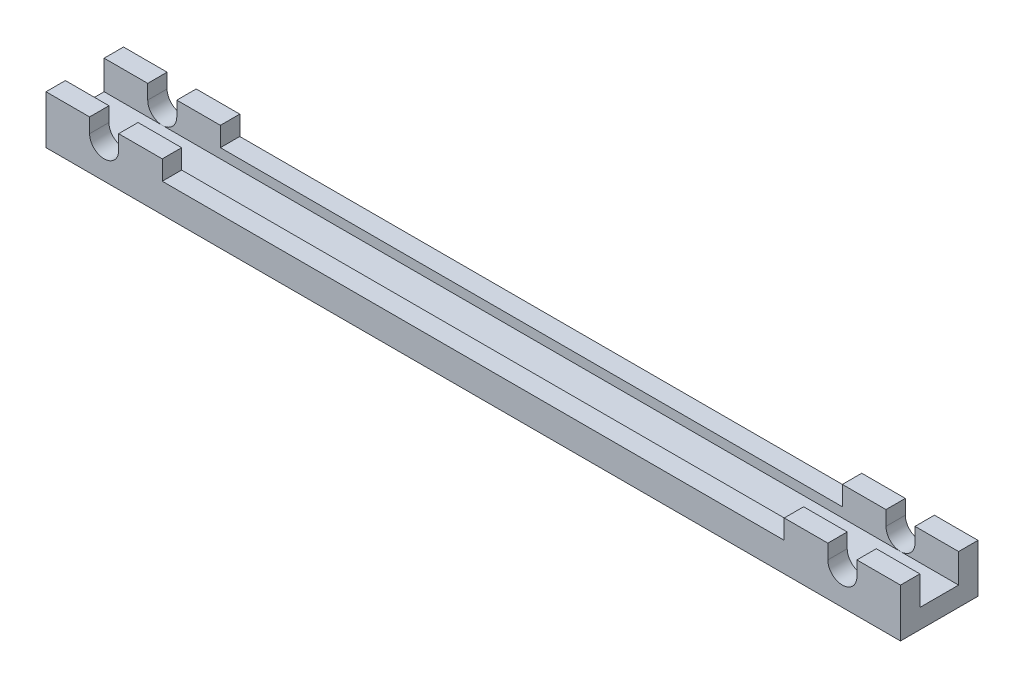
ISO-10303-21;
HEADER;
FILE_DESCRIPTION(('STEP AP214'),'2;1');
FILE_NAME('part.step','',(''),(''),'','','');
FILE_SCHEMA(('AUTOMOTIVE_DESIGN { 1 0 10303 214 1 1 1 1 }'));
ENDSEC;
DATA;
#1=APPLICATION_CONTEXT('core data for automotive mechanical design processes');
#2=APPLICATION_PROTOCOL_DEFINITION('international standard','automotive_design',2000,#1);
#3=PRODUCT_CONTEXT('',#1,'mechanical');
#4=PRODUCT('Part','Part','',(#3));
#5=PRODUCT_RELATED_PRODUCT_CATEGORY('part','',(#4));
#6=PRODUCT_DEFINITION_FORMATION('','',#4);
#7=PRODUCT_DEFINITION_CONTEXT('part definition',#1,'design');
#8=PRODUCT_DEFINITION('design','',#6,#7);
#9=PRODUCT_DEFINITION_SHAPE('','',#8);
#10=(LENGTH_UNIT() NAMED_UNIT(*) SI_UNIT(.MILLI.,.METRE.));
#11=(NAMED_UNIT(*) PLANE_ANGLE_UNIT() SI_UNIT($,.RADIAN.));
#12=(NAMED_UNIT(*) SI_UNIT($,.STERADIAN.) SOLID_ANGLE_UNIT());
#13=UNCERTAINTY_MEASURE_WITH_UNIT(LENGTH_MEASURE(1.E-05),#10,'distance_accuracy_value','');
#14=(GEOMETRIC_REPRESENTATION_CONTEXT(3) GLOBAL_UNCERTAINTY_ASSIGNED_CONTEXT((#13)) GLOBAL_UNIT_ASSIGNED_CONTEXT((#10,
#11,#12)) REPRESENTATION_CONTEXT('',''));
#15=CARTESIAN_POINT('',(0.,0.,0.));
#16=DIRECTION('',(0.,0.,1.));
#17=DIRECTION('',(1.,0.,0.));
#18=AXIS2_PLACEMENT_3D('',#15,#16,#17);
#19=CARTESIAN_POINT('',(0.,2.,3.99999999999999));
#20=DIRECTION('',(0.,0.,-1.));
#21=DIRECTION('',(-1.,0.,0.));
#22=AXIS2_PLACEMENT_3D('',#19,#20,#21);
#23=PLANE('',#22);
#24=DIRECTION('',(0.,1.,0.));
#25=VECTOR('',#24,1.);
#26=CARTESIAN_POINT('',(-39.6,5.,3.99999999999999));
#27=LINE('',#26,#25);
#28=CARTESIAN_POINT('',(-39.6,3.5,3.99999999999999));
#29=VERTEX_POINT('',#28);
#30=CARTESIAN_POINT('',(-39.6,5.,3.99999999999999));
#31=VERTEX_POINT('',#30);
#32=EDGE_CURVE('E291',#29,#31,#27,.T.);
#33=ORIENTED_EDGE('',*,*,#32,.T.);
#34=DIRECTION('',(-1.,0.,0.));
#35=VECTOR('',#34,1.);
#36=CARTESIAN_POINT('',(-44.1,5.,3.99999999999999));
#37=LINE('',#36,#35);
#38=CARTESIAN_POINT('',(-44.1,5.,3.99999999999999));
#39=VERTEX_POINT('',#38);
#40=EDGE_CURVE('E334',#31,#39,#37,.T.);
#41=ORIENTED_EDGE('',*,*,#40,.T.);
#42=DIRECTION('',(0.,-1.,0.));
#43=VECTOR('',#42,1.);
#44=CARTESIAN_POINT('',(-44.1,2.,3.99999999999999));
#45=LINE('',#44,#43);
#46=CARTESIAN_POINT('',(-44.1,0.,3.99999999999999));
#47=VERTEX_POINT('',#46);
#48=EDGE_CURVE('E377',#39,#47,#45,.T.);
#49=ORIENTED_EDGE('',*,*,#48,.T.);
#50=DIRECTION('',(1.,0.,0.));
#51=VECTOR('',#50,1.);
#52=CARTESIAN_POINT('',(0.,0.,3.99999999999999));
#53=LINE('',#52,#51);
#54=CARTESIAN_POINT('',(44.1,0.,3.99999999999999));
#55=VERTEX_POINT('',#54);
#56=EDGE_CURVE('E487',#47,#55,#53,.T.);
#57=ORIENTED_EDGE('',*,*,#56,.T.);
#58=DIRECTION('',(0.,-1.,0.));
#59=VECTOR('',#58,1.);
#60=CARTESIAN_POINT('',(44.1,2.,3.99999999999999));
#61=LINE('',#60,#59);
#62=CARTESIAN_POINT('',(44.1,5.,3.99999999999999));
#63=VERTEX_POINT('',#62);
#64=EDGE_CURVE('E499',#63,#55,#61,.T.);
#65=ORIENTED_EDGE('',*,*,#64,.F.);
#66=DIRECTION('',(1.,0.,0.));
#67=VECTOR('',#66,1.);
#68=CARTESIAN_POINT('',(44.1,5.,3.99999999999999));
#69=LINE('',#68,#67);
#70=CARTESIAN_POINT('',(39.6,5.,4.));
#71=VERTEX_POINT('',#70);
#72=EDGE_CURVE('E447',#71,#63,#69,.T.);
#73=ORIENTED_EDGE('',*,*,#72,.F.);
#74=DIRECTION('',(0.,1.,0.));
#75=VECTOR('',#74,1.);
#76=CARTESIAN_POINT('',(39.6,5.,3.99999999999999));
#77=LINE('',#76,#75);
#78=CARTESIAN_POINT('',(39.6,3.5,3.99999999999999));
#79=VERTEX_POINT('',#78);
#80=EDGE_CURVE('E406',#79,#71,#77,.T.);
#81=ORIENTED_EDGE('',*,*,#80,.F.);
#82=CARTESIAN_POINT('',(38.1,3.5,3.99999999999999));
#83=DIRECTION('',(0.,0.,1.));
#84=DIRECTION('',(1.,0.,0.));
#85=AXIS2_PLACEMENT_3D('',#82,#83,#84);
#86=CIRCLE('',#85,1.5);
#87=CARTESIAN_POINT('',(36.6,3.5,3.99999999999999));
#88=VERTEX_POINT('',#87);
#89=EDGE_CURVE('E392',#88,#79,#86,.T.);
#90=ORIENTED_EDGE('',*,*,#89,.F.);
#91=DIRECTION('',(0.,-1.,0.));
#92=VECTOR('',#91,1.);
#93=CARTESIAN_POINT('',(36.6,3.5,3.99999999999999));
#94=LINE('',#93,#92);
#95=CARTESIAN_POINT('',(36.6,5.,3.99999999999999));
#96=VERTEX_POINT('',#95);
#97=EDGE_CURVE('E397',#96,#88,#94,.T.);
#98=ORIENTED_EDGE('',*,*,#97,.F.);
#99=CARTESIAN_POINT('',(32.1,5.,4.));
#100=VERTEX_POINT('',#99);
#101=EDGE_CURVE('E448',#100,#96,#69,.T.);
#102=ORIENTED_EDGE('',*,*,#101,.F.);
#103=DIRECTION('',(0.,-1.,0.));
#104=VECTOR('',#103,1.);
#105=CARTESIAN_POINT('',(32.1,5.,4.));
#106=LINE('',#105,#104);
#107=CARTESIAN_POINT('',(32.1,3.,4.));
#108=VERTEX_POINT('',#107);
#109=EDGE_CURVE('E451',#100,#108,#106,.T.);
#110=ORIENTED_EDGE('',*,*,#109,.T.);
#111=DIRECTION('',(1.,0.,0.));
#112=VECTOR('',#111,1.);
#113=CARTESIAN_POINT('',(32.1,3.,4.));
#114=LINE('',#113,#112);
#115=CARTESIAN_POINT('',(-32.1,3.,4.));
#116=VERTEX_POINT('',#115);
#117=EDGE_CURVE('E390',#116,#108,#114,.T.);
#118=ORIENTED_EDGE('',*,*,#117,.F.);
#119=DIRECTION('',(0.,-1.,0.));
#120=VECTOR('',#119,1.);
#121=CARTESIAN_POINT('',(-32.1,5.,4.));
#122=LINE('',#121,#120);
#123=CARTESIAN_POINT('',(-32.1,5.,4.));
#124=VERTEX_POINT('',#123);
#125=EDGE_CURVE('E354',#124,#116,#122,.T.);
#126=ORIENTED_EDGE('',*,*,#125,.F.);
#127=CARTESIAN_POINT('',(-36.6,5.,4.));
#128=VERTEX_POINT('',#127);
#129=EDGE_CURVE('E336',#124,#128,#37,.T.);
#130=ORIENTED_EDGE('',*,*,#129,.T.);
#131=DIRECTION('',(0.,-1.,0.));
#132=VECTOR('',#131,1.);
#133=CARTESIAN_POINT('',(-36.6,3.5,3.99999999999999));
#134=LINE('',#133,#132);
#135=CARTESIAN_POINT('',(-36.6,3.5,3.99999999999999));
#136=VERTEX_POINT('',#135);
#137=EDGE_CURVE('E298',#128,#136,#134,.T.);
#138=ORIENTED_EDGE('',*,*,#137,.T.);
#139=CARTESIAN_POINT('',(-38.1,3.5,3.99999999999999));
#140=DIRECTION('',(0.,0.,-1.));
#141=DIRECTION('',(-1.,0.,0.));
#142=AXIS2_PLACEMENT_3D('',#139,#140,#141);
#143=CIRCLE('',#142,1.5);
#144=EDGE_CURVE('E285',#136,#29,#143,.T.);
#145=ORIENTED_EDGE('',*,*,#144,.T.);
#146=EDGE_LOOP('',(#33,#41,#49,#57,#65,#73,#81,#90,#98,#102,#110,#118,#126,#130,#138,#145));
#147=FACE_BOUND('',#146,.T.);
#148=ADVANCED_FACE('F37',(#147),#23,.F.);
#149=CARTESIAN_POINT('',(0.,2.,-3.99999999999999));
#150=DIRECTION('',(0.,0.,1.));
#151=DIRECTION('',(1.,0.,0.));
#152=AXIS2_PLACEMENT_3D('',#149,#150,#151);
#153=PLANE('',#152);
#154=DIRECTION('',(0.,-1.,0.));
#155=VECTOR('',#154,1.);
#156=CARTESIAN_POINT('',(-32.1,5.,-4.));
#157=LINE('',#156,#155);
#158=CARTESIAN_POINT('',(-32.1,5.,-4.));
#159=VERTEX_POINT('',#158);
#160=CARTESIAN_POINT('',(-32.1,3.,-4.));
#161=VERTEX_POINT('',#160);
#162=EDGE_CURVE('E280',#159,#161,#157,.T.);
#163=ORIENTED_EDGE('',*,*,#162,.T.);
#164=DIRECTION('',(-1.,0.,0.));
#165=VECTOR('',#164,1.);
#166=CARTESIAN_POINT('',(32.1,3.,-3.99999999999999));
#167=LINE('',#166,#165);
#168=CARTESIAN_POINT('',(32.1,3.,-3.99999999999999));
#169=VERTEX_POINT('',#168);
#170=EDGE_CURVE('E51',#169,#161,#167,.T.);
#171=ORIENTED_EDGE('',*,*,#170,.F.);
#172=DIRECTION('',(0.,-1.,0.));
#173=VECTOR('',#172,1.);
#174=CARTESIAN_POINT('',(32.1,5.,-4.));
#175=LINE('',#174,#173);
#176=CARTESIAN_POINT('',(32.1,5.,-4.));
#177=VERTEX_POINT('',#176);
#178=EDGE_CURVE('E484',#177,#169,#175,.T.);
#179=ORIENTED_EDGE('',*,*,#178,.F.);
#180=DIRECTION('',(-1.,0.,0.));
#181=VECTOR('',#180,1.);
#182=CARTESIAN_POINT('',(44.1,5.,-4.00000000000001));
#183=LINE('',#182,#181);
#184=CARTESIAN_POINT('',(36.6,5.,-4.00000000000001));
#185=VERTEX_POINT('',#184);
#186=EDGE_CURVE('E467',#185,#177,#183,.T.);
#187=ORIENTED_EDGE('',*,*,#186,.F.);
#188=DIRECTION('',(0.,-1.,0.));
#189=VECTOR('',#188,1.);
#190=CARTESIAN_POINT('',(36.6,3.5,-4.00000000000001));
#191=LINE('',#190,#189);
#192=CARTESIAN_POINT('',(36.6,3.5,-4.00000000000001));
#193=VERTEX_POINT('',#192);
#194=EDGE_CURVE('E400',#185,#193,#191,.T.);
#195=ORIENTED_EDGE('',*,*,#194,.T.);
#196=CARTESIAN_POINT('',(38.1,3.5,-4.00000000000001));
#197=DIRECTION('',(0.,0.,1.));
#198=DIRECTION('',(1.,0.,0.));
#199=AXIS2_PLACEMENT_3D('',#196,#197,#198);
#200=CIRCLE('',#199,1.5);
#201=CARTESIAN_POINT('',(39.6,3.5,-4.00000000000001));
#202=VERTEX_POINT('',#201);
#203=EDGE_CURVE('E393',#193,#202,#200,.T.);
#204=ORIENTED_EDGE('',*,*,#203,.T.);
#205=DIRECTION('',(0.,1.,0.));
#206=VECTOR('',#205,1.);
#207=CARTESIAN_POINT('',(39.6,5.,-4.00000000000001));
#208=LINE('',#207,#206);
#209=CARTESIAN_POINT('',(39.6,5.,-4.00000000000001));
#210=VERTEX_POINT('',#209);
#211=EDGE_CURVE('E396',#202,#210,#208,.T.);
#212=ORIENTED_EDGE('',*,*,#211,.T.);
#213=CARTESIAN_POINT('',(44.1,5.,-4.00000000000001));
#214=VERTEX_POINT('',#213);
#215=EDGE_CURVE('E469',#214,#210,#183,.T.);
#216=ORIENTED_EDGE('',*,*,#215,.F.);
#217=DIRECTION('',(0.,-1.,0.));
#218=VECTOR('',#217,1.);
#219=CARTESIAN_POINT('',(44.1,2.,-4.00000000000001));
#220=LINE('',#219,#218);
#221=CARTESIAN_POINT('',(44.1,0.,-4.00000000000001));
#222=VERTEX_POINT('',#221);
#223=EDGE_CURVE('E491',#214,#222,#220,.T.);
#224=ORIENTED_EDGE('',*,*,#223,.T.);
#225=DIRECTION('',(-1.,0.,0.));
#226=VECTOR('',#225,1.);
#227=CARTESIAN_POINT('',(0.,0.,-3.99999999999999));
#228=LINE('',#227,#226);
#229=CARTESIAN_POINT('',(-44.1,0.,-4.00000000000001));
#230=VERTEX_POINT('',#229);
#231=EDGE_CURVE('E492',#222,#230,#228,.T.);
#232=ORIENTED_EDGE('',*,*,#231,.T.);
#233=DIRECTION('',(0.,-1.,0.));
#234=VECTOR('',#233,1.);
#235=CARTESIAN_POINT('',(-44.1,2.,-4.00000000000001));
#236=LINE('',#235,#234);
#237=CARTESIAN_POINT('',(-44.1,5.,-4.00000000000001));
#238=VERTEX_POINT('',#237);
#239=EDGE_CURVE('E382',#238,#230,#236,.T.);
#240=ORIENTED_EDGE('',*,*,#239,.F.);
#241=DIRECTION('',(1.,0.,0.));
#242=VECTOR('',#241,1.);
#243=CARTESIAN_POINT('',(-44.1,5.,-4.00000000000001));
#244=LINE('',#243,#242);
#245=CARTESIAN_POINT('',(-39.6,5.,-4.00000000000001));
#246=VERTEX_POINT('',#245);
#247=EDGE_CURVE('E366',#238,#246,#244,.T.);
#248=ORIENTED_EDGE('',*,*,#247,.T.);
#249=DIRECTION('',(0.,1.,0.));
#250=VECTOR('',#249,1.);
#251=CARTESIAN_POINT('',(-39.6,5.,-4.00000000000001));
#252=LINE('',#251,#250);
#253=CARTESIAN_POINT('',(-39.6,3.5,-4.00000000000001));
#254=VERTEX_POINT('',#253);
#255=EDGE_CURVE('E293',#254,#246,#252,.T.);
#256=ORIENTED_EDGE('',*,*,#255,.F.);
#257=CARTESIAN_POINT('',(-38.1,3.5,-4.00000000000001));
#258=DIRECTION('',(0.,0.,-1.));
#259=DIRECTION('',(-1.,0.,0.));
#260=AXIS2_PLACEMENT_3D('',#257,#258,#259);
#261=CIRCLE('',#260,1.5);
#262=CARTESIAN_POINT('',(-36.6,3.5,-4.00000000000001));
#263=VERTEX_POINT('',#262);
#264=EDGE_CURVE('E288',#263,#254,#261,.T.);
#265=ORIENTED_EDGE('',*,*,#264,.F.);
#266=DIRECTION('',(0.,-1.,0.));
#267=VECTOR('',#266,1.);
#268=CARTESIAN_POINT('',(-36.6,3.5,-4.00000000000001));
#269=LINE('',#268,#267);
#270=CARTESIAN_POINT('',(-36.6,5.,-4.00000000000001));
#271=VERTEX_POINT('',#270);
#272=EDGE_CURVE('E290',#271,#263,#269,.T.);
#273=ORIENTED_EDGE('',*,*,#272,.F.);
#274=EDGE_CURVE('E365',#271,#159,#244,.T.);
#275=ORIENTED_EDGE('',*,*,#274,.T.);
#276=EDGE_LOOP('',(#163,#171,#179,#187,#195,#204,#212,#216,#224,#232,#240,#248,#256,#265,#273,#275));
#277=FACE_BOUND('',#276,.T.);
#278=ADVANCED_FACE('F572',(#277),#153,.F.);
#279=CARTESIAN_POINT('',(-44.1,5.,-2.00000000000001));
#280=DIRECTION('',(0.,0.,1.));
#281=DIRECTION('',(1.,0.,0.));
#282=AXIS2_PLACEMENT_3D('',#279,#280,#281);
#283=PLANE('',#282);
#284=CARTESIAN_POINT('',(-38.1,3.5,-2.));
#285=DIRECTION('',(0.,0.,1.));
#286=DIRECTION('',(1.,0.,0.));
#287=AXIS2_PLACEMENT_3D('',#284,#285,#286);
#288=CIRCLE('',#287,1.5);
#289=CARTESIAN_POINT('',(-38.1,2.,-2.));
#290=VERTEX_POINT('',#289);
#291=CARTESIAN_POINT('',(-39.6,3.5,-2.));
#292=VERTEX_POINT('',#291);
#293=EDGE_CURVE('E330',#290,#292,#288,.F.);
#294=ORIENTED_EDGE('',*,*,#293,.T.);
#295=DIRECTION('',(0.,1.,0.));
#296=VECTOR('',#295,1.);
#297=CARTESIAN_POINT('',(-39.6,5.,-2.));
#298=LINE('',#297,#296);
#299=CARTESIAN_POINT('',(-39.6,5.,-2.));
#300=VERTEX_POINT('',#299);
#301=EDGE_CURVE('E324',#292,#300,#298,.T.);
#302=ORIENTED_EDGE('',*,*,#301,.T.);
#303=DIRECTION('',(-1.,0.,0.));
#304=VECTOR('',#303,1.);
#305=CARTESIAN_POINT('',(-44.1,5.,-2.00000000000001));
#306=LINE('',#305,#304);
#307=CARTESIAN_POINT('',(-44.1,5.,-2.00000000000001));
#308=VERTEX_POINT('',#307);
#309=EDGE_CURVE('E361',#300,#308,#306,.T.);
#310=ORIENTED_EDGE('',*,*,#309,.T.);
#311=DIRECTION('',(0.,-1.,0.));
#312=VECTOR('',#311,1.);
#313=CARTESIAN_POINT('',(-44.1,5.,-2.00000000000001));
#314=LINE('',#313,#312);
#315=CARTESIAN_POINT('',(-44.1,2.,-2.00000000000001));
#316=VERTEX_POINT('',#315);
#317=EDGE_CURVE('E279',#308,#316,#314,.T.);
#318=ORIENTED_EDGE('',*,*,#317,.T.);
#319=DIRECTION('',(-1.,0.,0.));
#320=VECTOR('',#319,1.);
#321=CARTESIAN_POINT('',(-44.1,2.,-2.00000000000001));
#322=LINE('',#321,#320);
#323=EDGE_CURVE('E357',#290,#316,#322,.T.);
#324=ORIENTED_EDGE('',*,*,#323,.F.);
#325=EDGE_LOOP('',(#294,#302,#310,#318,#324));
#326=FACE_BOUND('',#325,.T.);
#327=ADVANCED_FACE('F544',(#326),#283,.T.);
#328=CARTESIAN_POINT('',(0.,5.,0.));
#329=DIRECTION('',(0.,-1.,0.));
#330=DIRECTION('',(0.,0.,-1.));
#331=AXIS2_PLACEMENT_3D('',#328,#329,#330);
#332=PLANE('',#331);
#333=DIRECTION('',(0.,0.,1.));
#334=VECTOR('',#333,1.);
#335=CARTESIAN_POINT('',(-39.6,5.,-4.00000000000001));
#336=LINE('',#335,#334);
#337=EDGE_CURVE('E308',#246,#300,#336,.T.);
#338=ORIENTED_EDGE('',*,*,#337,.F.);
#339=ORIENTED_EDGE('',*,*,#247,.F.);
#340=DIRECTION('',(0.,0.,-1.));
#341=VECTOR('',#340,1.);
#342=CARTESIAN_POINT('',(-44.1,5.,-4.00000000000001));
#343=LINE('',#342,#341);
#344=EDGE_CURVE('E358',#308,#238,#343,.T.);
#345=ORIENTED_EDGE('',*,*,#344,.F.);
#346=ORIENTED_EDGE('',*,*,#309,.F.);
#347=EDGE_LOOP('',(#338,#339,#345,#346));
#348=FACE_BOUND('',#347,.T.);
#349=ADVANCED_FACE('F548',(#348),#332,.F.);
#350=DIRECTION('',(0.,0.,1.));
#351=VECTOR('',#350,1.);
#352=CARTESIAN_POINT('',(-36.6,5.,-4.00000000000001));
#353=LINE('',#352,#351);
#354=CARTESIAN_POINT('',(-36.6,5.,-2.));
#355=VERTEX_POINT('',#354);
#356=EDGE_CURVE('E310',#271,#355,#353,.T.);
#357=ORIENTED_EDGE('',*,*,#356,.T.);
#358=CARTESIAN_POINT('',(-32.1,5.,-2.));
#359=VERTEX_POINT('',#358);
#360=EDGE_CURVE('E362',#359,#355,#306,.T.);
#361=ORIENTED_EDGE('',*,*,#360,.F.);
#362=DIRECTION('',(0.,0.,1.));
#363=VECTOR('',#362,1.);
#364=CARTESIAN_POINT('',(-32.1,5.,-4.));
#365=LINE('',#364,#363);
#366=EDGE_CURVE('E278',#159,#359,#365,.T.);
#367=ORIENTED_EDGE('',*,*,#366,.F.);
#368=ORIENTED_EDGE('',*,*,#274,.F.);
#369=EDGE_LOOP('',(#357,#361,#367,#368));
#370=FACE_BOUND('',#369,.T.);
#371=ADVANCED_FACE('F568',(#370),#332,.F.);
#372=CARTESIAN_POINT('',(-44.1,5.,1.99999999999999));
#373=DIRECTION('',(0.,0.,-1.));
#374=DIRECTION('',(-1.,0.,0.));
#375=AXIS2_PLACEMENT_3D('',#372,#373,#374);
#376=PLANE('',#375);
#377=DIRECTION('',(1.,0.,0.));
#378=VECTOR('',#377,1.);
#379=CARTESIAN_POINT('',(-44.1,5.,1.99999999999999));
#380=LINE('',#379,#378);
#381=CARTESIAN_POINT('',(-44.1,5.,1.99999999999999));
#382=VERTEX_POINT('',#381);
#383=CARTESIAN_POINT('',(-39.6,5.,1.99999999999999));
#384=VERTEX_POINT('',#383);
#385=EDGE_CURVE('E343',#382,#384,#380,.T.);
#386=ORIENTED_EDGE('',*,*,#385,.T.);
#387=DIRECTION('',(0.,-1.,0.));
#388=VECTOR('',#387,1.);
#389=CARTESIAN_POINT('',(-39.6,5.,2.));
#390=LINE('',#389,#388);
#391=CARTESIAN_POINT('',(-39.6,3.5,1.99999999999999));
#392=VERTEX_POINT('',#391);
#393=EDGE_CURVE('E321',#384,#392,#390,.T.);
#394=ORIENTED_EDGE('',*,*,#393,.T.);
#395=CARTESIAN_POINT('',(-38.1,3.5,2.));
#396=DIRECTION('',(0.,0.,-1.));
#397=DIRECTION('',(-1.,0.,0.));
#398=AXIS2_PLACEMENT_3D('',#395,#396,#397);
#399=CIRCLE('',#398,1.5);
#400=CARTESIAN_POINT('',(-38.1,2.,2.));
#401=VERTEX_POINT('',#400);
#402=EDGE_CURVE('E11',#392,#401,#399,.F.);
#403=ORIENTED_EDGE('',*,*,#402,.T.);
#404=DIRECTION('',(1.,0.,0.));
#405=VECTOR('',#404,1.);
#406=CARTESIAN_POINT('',(-44.1,2.,1.99999999999999));
#407=LINE('',#406,#405);
#408=CARTESIAN_POINT('',(-44.1,2.,1.99999999999999));
#409=VERTEX_POINT('',#408);
#410=EDGE_CURVE('E335',#409,#401,#407,.T.);
#411=ORIENTED_EDGE('',*,*,#410,.F.);
#412=DIRECTION('',(0.,-1.,0.));
#413=VECTOR('',#412,1.);
#414=CARTESIAN_POINT('',(-44.1,5.,1.99999999999999));
#415=LINE('',#414,#413);
#416=EDGE_CURVE('E346',#382,#409,#415,.T.);
#417=ORIENTED_EDGE('',*,*,#416,.F.);
#418=EDGE_LOOP('',(#386,#394,#403,#411,#417));
#419=FACE_BOUND('',#418,.T.);
#420=ADVANCED_FACE('F531',(#419),#376,.T.);
#421=CARTESIAN_POINT('',(0.,5.,0.));
#422=DIRECTION('',(0.,1.,0.));
#423=DIRECTION('',(0.,0.,1.));
#424=AXIS2_PLACEMENT_3D('',#421,#422,#423);
#425=PLANE('',#424);
#426=ORIENTED_EDGE('',*,*,#40,.F.);
#427=DIRECTION('',(0.,0.,-1.));
#428=VECTOR('',#427,1.);
#429=CARTESIAN_POINT('',(-39.6,5.,0.));
#430=LINE('',#429,#428);
#431=EDGE_CURVE('E512',#31,#384,#430,.T.);
#432=ORIENTED_EDGE('',*,*,#431,.T.);
#433=ORIENTED_EDGE('',*,*,#385,.F.);
#434=DIRECTION('',(0.,0.,-1.));
#435=VECTOR('',#434,1.);
#436=CARTESIAN_POINT('',(-44.1,5.,3.99999999999999));
#437=LINE('',#436,#435);
#438=EDGE_CURVE('E331',#39,#382,#437,.T.);
#439=ORIENTED_EDGE('',*,*,#438,.F.);
#440=EDGE_LOOP('',(#426,#432,#433,#439));
#441=FACE_BOUND('',#440,.T.);
#442=ADVANCED_FACE('F559',(#441),#425,.T.);
#443=CARTESIAN_POINT('',(-36.6,5.,1.99999999999999));
#444=VERTEX_POINT('',#443);
#445=CARTESIAN_POINT('',(-32.1,5.,2.));
#446=VERTEX_POINT('',#445);
#447=EDGE_CURVE('E342',#444,#446,#380,.T.);
#448=ORIENTED_EDGE('',*,*,#447,.F.);
#449=DIRECTION('',(0.,0.,1.));
#450=VECTOR('',#449,1.);
#451=CARTESIAN_POINT('',(-36.6,5.,0.));
#452=LINE('',#451,#450);
#453=EDGE_CURVE('E510',#444,#128,#452,.T.);
#454=ORIENTED_EDGE('',*,*,#453,.T.);
#455=ORIENTED_EDGE('',*,*,#129,.F.);
#456=DIRECTION('',(0.,0.,1.));
#457=VECTOR('',#456,1.);
#458=CARTESIAN_POINT('',(-32.1,5.,4.));
#459=LINE('',#458,#457);
#460=EDGE_CURVE('E339',#446,#124,#459,.T.);
#461=ORIENTED_EDGE('',*,*,#460,.F.);
#462=EDGE_LOOP('',(#448,#454,#455,#461));
#463=FACE_BOUND('',#462,.T.);
#464=ADVANCED_FACE('F561',(#463),#425,.T.);
#465=CARTESIAN_POINT('',(0.,2.,0.));
#466=DIRECTION('',(0.,-1.,0.));
#467=DIRECTION('',(0.,0.,-1.));
#468=AXIS2_PLACEMENT_3D('',#465,#466,#467);
#469=PLANE('',#468);
#470=DIRECTION('',(1.,0.,0.));
#471=VECTOR('',#470,1.);
#472=CARTESIAN_POINT('',(44.1,2.,-2.00000000000001));
#473=LINE('',#472,#471);
#474=CARTESIAN_POINT('',(38.1,2.,-2.));
#475=VERTEX_POINT('',#474);
#476=EDGE_CURVE('E468',#290,#475,#473,.T.);
#477=ORIENTED_EDGE('',*,*,#476,.F.);
#478=ORIENTED_EDGE('',*,*,#323,.T.);
#479=DIRECTION('',(0.,0.,-1.));
#480=VECTOR('',#479,1.);
#481=CARTESIAN_POINT('',(-44.1,2.,3.99999999999999));
#482=LINE('',#481,#480);
#483=EDGE_CURVE('E374',#409,#316,#482,.T.);
#484=ORIENTED_EDGE('',*,*,#483,.F.);
#485=ORIENTED_EDGE('',*,*,#410,.T.);
#486=DIRECTION('',(-1.,0.,0.));
#487=VECTOR('',#486,1.);
#488=CARTESIAN_POINT('',(44.1,2.,1.99999999999999));
#489=LINE('',#488,#487);
#490=CARTESIAN_POINT('',(38.1,2.,2.));
#491=VERTEX_POINT('',#490);
#492=EDGE_CURVE('E454',#491,#401,#489,.T.);
#493=ORIENTED_EDGE('',*,*,#492,.F.);
#494=CARTESIAN_POINT('',(44.1,2.,1.99999999999999));
#495=VERTEX_POINT('',#494);
#496=EDGE_CURVE('E441',#495,#491,#489,.T.);
#497=ORIENTED_EDGE('',*,*,#496,.F.);
#498=DIRECTION('',(0.,0.,-1.));
#499=VECTOR('',#498,1.);
#500=CARTESIAN_POINT('',(44.1,2.,3.99999999999999));
#501=LINE('',#500,#499);
#502=CARTESIAN_POINT('',(44.1,2.,-2.));
#503=VERTEX_POINT('',#502);
#504=EDGE_CURVE('E488',#495,#503,#501,.T.);
#505=ORIENTED_EDGE('',*,*,#504,.T.);
#506=EDGE_CURVE('E463',#475,#503,#473,.T.);
#507=ORIENTED_EDGE('',*,*,#506,.F.);
#508=EDGE_LOOP('',(#477,#478,#484,#485,#493,#497,#505,#507));
#509=FACE_BOUND('',#508,.T.);
#510=ADVANCED_FACE('F534',(#509),#469,.F.);
#511=CARTESIAN_POINT('',(44.1,5.,-2.00000000000001));
#512=DIRECTION('',(0.,0.,-1.));
#513=DIRECTION('',(-1.,0.,0.));
#514=AXIS2_PLACEMENT_3D('',#511,#512,#513);
#515=PLANE('',#514);
#516=CARTESIAN_POINT('',(38.1,3.5,-2.));
#517=DIRECTION('',(0.,0.,-1.));
#518=DIRECTION('',(-1.,0.,0.));
#519=AXIS2_PLACEMENT_3D('',#516,#517,#518);
#520=CIRCLE('',#519,1.5);
#521=CARTESIAN_POINT('',(36.6,3.5,-2.));
#522=VERTEX_POINT('',#521);
#523=EDGE_CURVE('E434',#475,#522,#520,.T.);
#524=ORIENTED_EDGE('',*,*,#523,.T.);
#525=DIRECTION('',(0.,1.,0.));
#526=VECTOR('',#525,1.);
#527=CARTESIAN_POINT('',(36.6,5.,-2.));
#528=LINE('',#527,#526);
#529=CARTESIAN_POINT('',(36.6,5.,-2.));
#530=VERTEX_POINT('',#529);
#531=EDGE_CURVE('E431',#522,#530,#528,.T.);
#532=ORIENTED_EDGE('',*,*,#531,.T.);
#533=DIRECTION('',(1.,0.,0.));
#534=VECTOR('',#533,1.);
#535=CARTESIAN_POINT('',(44.1,5.,-2.00000000000001));
#536=LINE('',#535,#534);
#537=CARTESIAN_POINT('',(32.1,5.,-2.));
#538=VERTEX_POINT('',#537);
#539=EDGE_CURVE('E475',#538,#530,#536,.T.);
#540=ORIENTED_EDGE('',*,*,#539,.F.);
#541=DIRECTION('',(0.,-1.,0.));
#542=VECTOR('',#541,1.);
#543=CARTESIAN_POINT('',(32.1,5.,-2.));
#544=LINE('',#543,#542);
#545=CARTESIAN_POINT('',(32.1,3.,-2.));
#546=VERTEX_POINT('',#545);
#547=EDGE_CURVE('E267',#538,#546,#544,.T.);
#548=ORIENTED_EDGE('',*,*,#547,.T.);
#549=DIRECTION('',(1.,0.,0.));
#550=VECTOR('',#549,1.);
#551=CARTESIAN_POINT('',(32.1,3.,-2.));
#552=LINE('',#551,#550);
#553=CARTESIAN_POINT('',(-32.1,3.,-2.));
#554=VERTEX_POINT('',#553);
#555=EDGE_CURVE('E258',#554,#546,#552,.T.);
#556=ORIENTED_EDGE('',*,*,#555,.F.);
#557=DIRECTION('',(0.,-1.,0.));
#558=VECTOR('',#557,1.);
#559=CARTESIAN_POINT('',(-32.1,5.,-2.));
#560=LINE('',#559,#558);
#561=EDGE_CURVE('E263',#359,#554,#560,.T.);
#562=ORIENTED_EDGE('',*,*,#561,.F.);
#563=ORIENTED_EDGE('',*,*,#360,.T.);
#564=DIRECTION('',(0.,-1.,0.));
#565=VECTOR('',#564,1.);
#566=CARTESIAN_POINT('',(-36.6,5.,-2.));
#567=LINE('',#566,#565);
#568=CARTESIAN_POINT('',(-36.6,3.5,-2.));
#569=VERTEX_POINT('',#568);
#570=EDGE_CURVE('E318',#355,#569,#567,.T.);
#571=ORIENTED_EDGE('',*,*,#570,.T.);
#572=EDGE_CURVE('E327',#569,#290,#288,.F.);
#573=ORIENTED_EDGE('',*,*,#572,.T.);
#574=ORIENTED_EDGE('',*,*,#476,.T.);
#575=EDGE_LOOP('',(#524,#532,#540,#548,#556,#562,#563,#571,#573,#574));
#576=FACE_BOUND('',#575,.T.);
#577=ADVANCED_FACE('F261',(#576),#515,.F.);
#578=CARTESIAN_POINT('',(0.,5.,0.));
#579=DIRECTION('',(0.,-1.,0.));
#580=DIRECTION('',(0.,0.,-1.));
#581=AXIS2_PLACEMENT_3D('',#578,#579,#580);
#582=PLANE('',#581);
#583=ORIENTED_EDGE('',*,*,#539,.T.);
#584=DIRECTION('',(0.,0.,1.));
#585=VECTOR('',#584,1.);
#586=CARTESIAN_POINT('',(36.6,5.,-4.00000000000001));
#587=LINE('',#586,#585);
#588=EDGE_CURVE('E415',#185,#530,#587,.T.);
#589=ORIENTED_EDGE('',*,*,#588,.F.);
#590=ORIENTED_EDGE('',*,*,#186,.T.);
#591=DIRECTION('',(0.,0.,1.));
#592=VECTOR('',#591,1.);
#593=CARTESIAN_POINT('',(32.1,5.,-4.));
#594=LINE('',#593,#592);
#595=EDGE_CURVE('E472',#177,#538,#594,.T.);
#596=ORIENTED_EDGE('',*,*,#595,.T.);
#597=EDGE_LOOP('',(#583,#589,#590,#596));
#598=FACE_BOUND('',#597,.T.);
#599=ADVANCED_FACE('F665',(#598),#582,.F.);
#600=CARTESIAN_POINT('',(44.1,5.,1.99999999999999));
#601=DIRECTION('',(0.,0.,1.));
#602=DIRECTION('',(1.,0.,0.));
#603=AXIS2_PLACEMENT_3D('',#600,#601,#602);
#604=PLANE('',#603);
#605=DIRECTION('',(-1.,0.,0.));
#606=VECTOR('',#605,1.);
#607=CARTESIAN_POINT('',(44.1,5.,1.99999999999999));
#608=LINE('',#607,#606);
#609=CARTESIAN_POINT('',(36.6,5.,1.99999999999999));
#610=VERTEX_POINT('',#609);
#611=CARTESIAN_POINT('',(32.1,5.,2.));
#612=VERTEX_POINT('',#611);
#613=EDGE_CURVE('E440',#610,#612,#608,.T.);
#614=ORIENTED_EDGE('',*,*,#613,.F.);
#615=DIRECTION('',(0.,-1.,0.));
#616=VECTOR('',#615,1.);
#617=CARTESIAN_POINT('',(36.6,5.,2.));
#618=LINE('',#617,#616);
#619=CARTESIAN_POINT('',(36.6,3.5,2.));
#620=VERTEX_POINT('',#619);
#621=EDGE_CURVE('E428',#610,#620,#618,.T.);
#622=ORIENTED_EDGE('',*,*,#621,.T.);
#623=CARTESIAN_POINT('',(38.1,3.5,2.));
#624=DIRECTION('',(0.,0.,1.));
#625=DIRECTION('',(1.,0.,0.));
#626=AXIS2_PLACEMENT_3D('',#623,#624,#625);
#627=CIRCLE('',#626,1.5);
#628=EDGE_CURVE('E509',#620,#491,#627,.T.);
#629=ORIENTED_EDGE('',*,*,#628,.T.);
#630=ORIENTED_EDGE('',*,*,#492,.T.);
#631=CARTESIAN_POINT('',(-36.6,3.5,2.));
#632=VERTEX_POINT('',#631);
#633=EDGE_CURVE('E40',#401,#632,#399,.F.);
#634=ORIENTED_EDGE('',*,*,#633,.T.);
#635=DIRECTION('',(0.,1.,0.));
#636=VECTOR('',#635,1.);
#637=CARTESIAN_POINT('',(-36.6,5.,2.));
#638=LINE('',#637,#636);
#639=EDGE_CURVE('E306',#632,#444,#638,.T.);
#640=ORIENTED_EDGE('',*,*,#639,.T.);
#641=ORIENTED_EDGE('',*,*,#447,.T.);
#642=DIRECTION('',(0.,-1.,0.));
#643=VECTOR('',#642,1.);
#644=CARTESIAN_POINT('',(-32.1,5.,2.));
#645=LINE('',#644,#643);
#646=CARTESIAN_POINT('',(-32.1,3.,2.));
#647=VERTEX_POINT('',#646);
#648=EDGE_CURVE('E351',#446,#647,#645,.T.);
#649=ORIENTED_EDGE('',*,*,#648,.T.);
#650=DIRECTION('',(-1.,0.,0.));
#651=VECTOR('',#650,1.);
#652=CARTESIAN_POINT('',(32.1,3.,2.));
#653=LINE('',#652,#651);
#654=CARTESIAN_POINT('',(32.1,3.,2.));
#655=VERTEX_POINT('',#654);
#656=EDGE_CURVE('E59',#655,#647,#653,.T.);
#657=ORIENTED_EDGE('',*,*,#656,.F.);
#658=DIRECTION('',(0.,-1.,0.));
#659=VECTOR('',#658,1.);
#660=CARTESIAN_POINT('',(32.1,5.,2.));
#661=LINE('',#660,#659);
#662=EDGE_CURVE('E457',#612,#655,#661,.T.);
#663=ORIENTED_EDGE('',*,*,#662,.F.);
#664=EDGE_LOOP('',(#614,#622,#629,#630,#634,#640,#641,#649,#657,#663));
#665=FACE_BOUND('',#664,.T.);
#666=ADVANCED_FACE('F521',(#665),#604,.F.);
#667=CARTESIAN_POINT('',(0.,5.,0.));
#668=DIRECTION('',(0.,1.,0.));
#669=DIRECTION('',(0.,0.,1.));
#670=AXIS2_PLACEMENT_3D('',#667,#668,#669);
#671=PLANE('',#670);
#672=DIRECTION('',(0.,0.,1.));
#673=VECTOR('',#672,1.);
#674=CARTESIAN_POINT('',(36.6,5.,0.));
#675=LINE('',#674,#673);
#676=EDGE_CURVE('E504',#610,#96,#675,.T.);
#677=ORIENTED_EDGE('',*,*,#676,.F.);
#678=ORIENTED_EDGE('',*,*,#613,.T.);
#679=DIRECTION('',(0.,0.,1.));
#680=VECTOR('',#679,1.);
#681=CARTESIAN_POINT('',(32.1,5.,4.));
#682=LINE('',#681,#680);
#683=EDGE_CURVE('E445',#612,#100,#682,.T.);
#684=ORIENTED_EDGE('',*,*,#683,.T.);
#685=ORIENTED_EDGE('',*,*,#101,.T.);
#686=EDGE_LOOP('',(#677,#678,#684,#685));
#687=FACE_BOUND('',#686,.T.);
#688=ADVANCED_FACE('F585',(#687),#671,.T.);
#689=CARTESIAN_POINT('',(44.1,2.,3.99999999999999));
#690=DIRECTION('',(-1.,0.,0.));
#691=DIRECTION('',(0.,0.,1.));
#692=AXIS2_PLACEMENT_3D('',#689,#690,#691);
#693=PLANE('',#692);
#694=DIRECTION('',(0.,0.,-1.));
#695=VECTOR('',#694,1.);
#696=CARTESIAN_POINT('',(44.1,0.,3.99999999999999));
#697=LINE('',#696,#695);
#698=EDGE_CURVE('E494',#55,#222,#697,.T.);
#699=ORIENTED_EDGE('',*,*,#698,.T.);
#700=ORIENTED_EDGE('',*,*,#223,.F.);
#701=DIRECTION('',(0.,0.,-1.));
#702=VECTOR('',#701,1.);
#703=CARTESIAN_POINT('',(44.1,5.,-4.00000000000001));
#704=LINE('',#703,#702);
#705=CARTESIAN_POINT('',(44.1,5.,-2.00000000000001));
#706=VERTEX_POINT('',#705);
#707=EDGE_CURVE('E464',#706,#214,#704,.T.);
#708=ORIENTED_EDGE('',*,*,#707,.F.);
#709=DIRECTION('',(0.,-1.,0.));
#710=VECTOR('',#709,1.);
#711=CARTESIAN_POINT('',(44.1,5.,-2.00000000000001));
#712=LINE('',#711,#710);
#713=EDGE_CURVE('E478',#706,#503,#712,.T.);
#714=ORIENTED_EDGE('',*,*,#713,.T.);
#715=ORIENTED_EDGE('',*,*,#504,.F.);
#716=DIRECTION('',(0.,-1.,0.));
#717=VECTOR('',#716,1.);
#718=CARTESIAN_POINT('',(44.1,5.,1.99999999999999));
#719=LINE('',#718,#717);
#720=CARTESIAN_POINT('',(44.1,5.,1.99999999999999));
#721=VERTEX_POINT('',#720);
#722=EDGE_CURVE('E460',#721,#495,#719,.T.);
#723=ORIENTED_EDGE('',*,*,#722,.F.);
#724=DIRECTION('',(0.,0.,-1.));
#725=VECTOR('',#724,1.);
#726=CARTESIAN_POINT('',(44.1,5.,3.99999999999999));
#727=LINE('',#726,#725);
#728=EDGE_CURVE('E437',#63,#721,#727,.T.);
#729=ORIENTED_EDGE('',*,*,#728,.F.);
#730=ORIENTED_EDGE('',*,*,#64,.T.);
#731=EDGE_LOOP('',(#699,#700,#708,#714,#715,#723,#729,#730));
#732=FACE_BOUND('',#731,.T.);
#733=ADVANCED_FACE('F583',(#732),#693,.F.);
#734=CARTESIAN_POINT('',(0.,0.,0.));
#735=DIRECTION('',(0.,-1.,0.));
#736=DIRECTION('',(0.,0.,-1.));
#737=AXIS2_PLACEMENT_3D('',#734,#735,#736);
#738=PLANE('',#737);
#739=ORIENTED_EDGE('',*,*,#56,.F.);
#740=DIRECTION('',(0.,0.,-1.));
#741=VECTOR('',#740,1.);
#742=CARTESIAN_POINT('',(-44.1,0.,3.99999999999999));
#743=LINE('',#742,#741);
#744=EDGE_CURVE('E373',#47,#230,#743,.T.);
#745=ORIENTED_EDGE('',*,*,#744,.T.);
#746=ORIENTED_EDGE('',*,*,#231,.F.);
#747=ORIENTED_EDGE('',*,*,#698,.F.);
#748=EDGE_LOOP('',(#739,#745,#746,#747));
#749=FACE_BOUND('',#748,.T.);
#750=ADVANCED_FACE('F554',(#749),#738,.T.);
#751=CARTESIAN_POINT('',(32.1,5.,-4.));
#752=DIRECTION('',(1.,0.,0.));
#753=DIRECTION('',(0.,0.,-1.));
#754=AXIS2_PLACEMENT_3D('',#751,#752,#753);
#755=PLANE('',#754);
#756=ORIENTED_EDGE('',*,*,#178,.T.);
#757=DIRECTION('',(0.,0.,-1.));
#758=VECTOR('',#757,1.);
#759=CARTESIAN_POINT('',(32.1,3.,-2.));
#760=LINE('',#759,#758);
#761=EDGE_CURVE('E385',#546,#169,#760,.T.);
#762=ORIENTED_EDGE('',*,*,#761,.F.);
#763=ORIENTED_EDGE('',*,*,#547,.F.);
#764=ORIENTED_EDGE('',*,*,#595,.F.);
#765=EDGE_LOOP('',(#756,#762,#763,#764));
#766=FACE_BOUND('',#765,.T.);
#767=ADVANCED_FACE('F591',(#766),#755,.F.);
#768=DIRECTION('',(0.,-1.,0.));
#769=VECTOR('',#768,1.);
#770=CARTESIAN_POINT('',(39.6,5.,-2.));
#771=LINE('',#770,#769);
#772=CARTESIAN_POINT('',(39.6,5.,-2.));
#773=VERTEX_POINT('',#772);
#774=CARTESIAN_POINT('',(39.6,3.5,-2.));
#775=VERTEX_POINT('',#774);
#776=EDGE_CURVE('E425',#773,#775,#771,.T.);
#777=ORIENTED_EDGE('',*,*,#776,.T.);
#778=EDGE_CURVE('E436',#775,#475,#520,.T.);
#779=ORIENTED_EDGE('',*,*,#778,.T.);
#780=ORIENTED_EDGE('',*,*,#506,.T.);
#781=ORIENTED_EDGE('',*,*,#713,.F.);
#782=EDGE_CURVE('E474',#773,#706,#536,.T.);
#783=ORIENTED_EDGE('',*,*,#782,.F.);
#784=EDGE_LOOP('',(#777,#779,#780,#781,#783));
#785=FACE_BOUND('',#784,.T.);
#786=ADVANCED_FACE('F605',(#785),#515,.F.);
#787=ORIENTED_EDGE('',*,*,#215,.T.);
#788=DIRECTION('',(0.,0.,1.));
#789=VECTOR('',#788,1.);
#790=CARTESIAN_POINT('',(39.6,5.,-4.00000000000001));
#791=LINE('',#790,#789);
#792=EDGE_CURVE('E417',#210,#773,#791,.T.);
#793=ORIENTED_EDGE('',*,*,#792,.T.);
#794=ORIENTED_EDGE('',*,*,#782,.T.);
#795=ORIENTED_EDGE('',*,*,#707,.T.);
#796=EDGE_LOOP('',(#787,#793,#794,#795));
#797=FACE_BOUND('',#796,.T.);
#798=ADVANCED_FACE('F600',(#797),#582,.F.);
#799=ORIENTED_EDGE('',*,*,#496,.T.);
#800=CARTESIAN_POINT('',(39.6,3.5,1.99999999999999));
#801=VERTEX_POINT('',#800);
#802=EDGE_CURVE('E506',#491,#801,#627,.T.);
#803=ORIENTED_EDGE('',*,*,#802,.T.);
#804=DIRECTION('',(0.,1.,0.));
#805=VECTOR('',#804,1.);
#806=CARTESIAN_POINT('',(39.6,5.,2.));
#807=LINE('',#806,#805);
#808=CARTESIAN_POINT('',(39.6,5.,1.99999999999999));
#809=VERTEX_POINT('',#808);
#810=EDGE_CURVE('E413',#801,#809,#807,.T.);
#811=ORIENTED_EDGE('',*,*,#810,.T.);
#812=EDGE_CURVE('E442',#721,#809,#608,.T.);
#813=ORIENTED_EDGE('',*,*,#812,.F.);
#814=ORIENTED_EDGE('',*,*,#722,.T.);
#815=EDGE_LOOP('',(#799,#803,#811,#813,#814));
#816=FACE_BOUND('',#815,.T.);
#817=ADVANCED_FACE('F609',(#816),#604,.F.);
#818=CARTESIAN_POINT('',(32.1,5.,4.));
#819=DIRECTION('',(1.,0.,0.));
#820=DIRECTION('',(0.,0.,-1.));
#821=AXIS2_PLACEMENT_3D('',#818,#819,#820);
#822=PLANE('',#821);
#823=ORIENTED_EDGE('',*,*,#662,.T.);
#824=DIRECTION('',(0.,0.,-1.));
#825=VECTOR('',#824,1.);
#826=CARTESIAN_POINT('',(32.1,3.,4.));
#827=LINE('',#826,#825);
#828=EDGE_CURVE('E269',#108,#655,#827,.T.);
#829=ORIENTED_EDGE('',*,*,#828,.F.);
#830=ORIENTED_EDGE('',*,*,#109,.F.);
#831=ORIENTED_EDGE('',*,*,#683,.F.);
#832=EDGE_LOOP('',(#823,#829,#830,#831));
#833=FACE_BOUND('',#832,.T.);
#834=ADVANCED_FACE('F631',(#833),#822,.F.);
#835=DIRECTION('',(0.,0.,-1.));
#836=VECTOR('',#835,1.);
#837=CARTESIAN_POINT('',(39.6,5.,0.));
#838=LINE('',#837,#836);
#839=EDGE_CURVE('E502',#71,#809,#838,.T.);
#840=ORIENTED_EDGE('',*,*,#839,.F.);
#841=ORIENTED_EDGE('',*,*,#72,.T.);
#842=ORIENTED_EDGE('',*,*,#728,.T.);
#843=ORIENTED_EDGE('',*,*,#812,.T.);
#844=EDGE_LOOP('',(#840,#841,#842,#843));
#845=FACE_BOUND('',#844,.T.);
#846=ADVANCED_FACE('F594',(#845),#671,.T.);
#847=CARTESIAN_POINT('',(39.6,5.,-4.00000000000001));
#848=DIRECTION('',(1.,0.,0.));
#849=DIRECTION('',(0.,0.,-1.));
#850=AXIS2_PLACEMENT_3D('',#847,#848,#849);
#851=PLANE('',#850);
#852=DIRECTION('',(0.,0.,1.));
#853=VECTOR('',#852,1.);
#854=CARTESIAN_POINT('',(39.6,3.5,-4.00000000000001));
#855=LINE('',#854,#853);
#856=EDGE_CURVE('E403',#801,#79,#855,.T.);
#857=ORIENTED_EDGE('',*,*,#856,.T.);
#858=ORIENTED_EDGE('',*,*,#80,.T.);
#859=ORIENTED_EDGE('',*,*,#839,.T.);
#860=ORIENTED_EDGE('',*,*,#810,.F.);
#861=EDGE_LOOP('',(#857,#858,#859,#860));
#862=FACE_BOUND('',#861,.T.);
#863=ADVANCED_FACE('F617',(#862),#851,.F.);
#864=CARTESIAN_POINT('',(36.6,3.5,-4.00000000000001));
#865=DIRECTION('',(-1.,0.,0.));
#866=DIRECTION('',(0.,0.,1.));
#867=AXIS2_PLACEMENT_3D('',#864,#865,#866);
#868=PLANE('',#867);
#869=ORIENTED_EDGE('',*,*,#676,.T.);
#870=ORIENTED_EDGE('',*,*,#97,.T.);
#871=DIRECTION('',(0.,0.,1.));
#872=VECTOR('',#871,1.);
#873=CARTESIAN_POINT('',(36.6,3.5,-4.00000000000001));
#874=LINE('',#873,#872);
#875=EDGE_CURVE('E414',#620,#88,#874,.T.);
#876=ORIENTED_EDGE('',*,*,#875,.F.);
#877=ORIENTED_EDGE('',*,*,#621,.F.);
#878=EDGE_LOOP('',(#869,#870,#876,#877));
#879=FACE_BOUND('',#878,.T.);
#880=ADVANCED_FACE('F623',(#879),#868,.F.);
#881=CARTESIAN_POINT('',(38.1,3.5,-4.00000000000001));
#882=DIRECTION('',(0.,0.,1.));
#883=DIRECTION('',(1.,0.,0.));
#884=AXIS2_PLACEMENT_3D('',#881,#882,#883);
#885=CYLINDRICAL_SURFACE('',#884,1.5);
#886=ORIENTED_EDGE('',*,*,#875,.T.);
#887=ORIENTED_EDGE('',*,*,#89,.T.);
#888=ORIENTED_EDGE('',*,*,#856,.F.);
#889=ORIENTED_EDGE('',*,*,#802,.F.);
#890=ORIENTED_EDGE('',*,*,#628,.F.);
#891=EDGE_LOOP('',(#886,#887,#888,#889,#890));
#892=FACE_BOUND('',#891,.T.);
#893=ADVANCED_FACE('F620',(#892),#885,.F.);
#894=EDGE_CURVE('E420',#202,#775,#855,.T.);
#895=ORIENTED_EDGE('',*,*,#894,.F.);
#896=ORIENTED_EDGE('',*,*,#203,.F.);
#897=EDGE_CURVE('E410',#193,#522,#874,.T.);
#898=ORIENTED_EDGE('',*,*,#897,.T.);
#899=ORIENTED_EDGE('',*,*,#523,.F.);
#900=ORIENTED_EDGE('',*,*,#778,.F.);
#901=EDGE_LOOP('',(#895,#896,#898,#899,#900));
#902=FACE_BOUND('',#901,.T.);
#903=ADVANCED_FACE('F652',(#902),#885,.F.);
#904=ORIENTED_EDGE('',*,*,#897,.F.);
#905=ORIENTED_EDGE('',*,*,#194,.F.);
#906=ORIENTED_EDGE('',*,*,#588,.T.);
#907=ORIENTED_EDGE('',*,*,#531,.F.);
#908=EDGE_LOOP('',(#904,#905,#906,#907));
#909=FACE_BOUND('',#908,.T.);
#910=ADVANCED_FACE('F646',(#909),#868,.F.);
#911=ORIENTED_EDGE('',*,*,#792,.F.);
#912=ORIENTED_EDGE('',*,*,#211,.F.);
#913=ORIENTED_EDGE('',*,*,#894,.T.);
#914=ORIENTED_EDGE('',*,*,#776,.F.);
#915=EDGE_LOOP('',(#911,#912,#913,#914));
#916=FACE_BOUND('',#915,.T.);
#917=ADVANCED_FACE('F639',(#916),#851,.F.);
#918=CARTESIAN_POINT('',(0.,3.,0.));
#919=DIRECTION('',(0.,1.,0.));
#920=DIRECTION('',(0.,0.,1.));
#921=AXIS2_PLACEMENT_3D('',#918,#919,#920);
#922=PLANE('',#921);
#923=ORIENTED_EDGE('',*,*,#828,.T.);
#924=ORIENTED_EDGE('',*,*,#656,.T.);
#925=DIRECTION('',(0.,0.,-1.));
#926=VECTOR('',#925,1.);
#927=CARTESIAN_POINT('',(-32.1,3.,4.));
#928=LINE('',#927,#926);
#929=EDGE_CURVE('E283',#116,#647,#928,.T.);
#930=ORIENTED_EDGE('',*,*,#929,.F.);
#931=ORIENTED_EDGE('',*,*,#117,.T.);
#932=EDGE_LOOP('',(#923,#924,#930,#931));
#933=FACE_BOUND('',#932,.T.);
#934=ADVANCED_FACE('F637',(#933),#922,.T.);
#935=CARTESIAN_POINT('',(0.,3.,0.));
#936=DIRECTION('',(0.,1.,0.));
#937=DIRECTION('',(0.,0.,1.));
#938=AXIS2_PLACEMENT_3D('',#935,#936,#937);
#939=PLANE('',#938);
#940=ORIENTED_EDGE('',*,*,#761,.T.);
#941=ORIENTED_EDGE('',*,*,#170,.T.);
#942=DIRECTION('',(0.,0.,-1.));
#943=VECTOR('',#942,1.);
#944=CARTESIAN_POINT('',(-32.1,3.,-2.));
#945=LINE('',#944,#943);
#946=EDGE_CURVE('E275',#554,#161,#945,.T.);
#947=ORIENTED_EDGE('',*,*,#946,.F.);
#948=ORIENTED_EDGE('',*,*,#555,.T.);
#949=EDGE_LOOP('',(#940,#941,#947,#948));
#950=FACE_BOUND('',#949,.T.);
#951=ADVANCED_FACE('F282',(#950),#939,.T.);
#952=CARTESIAN_POINT('',(-44.1,2.,3.99999999999999));
#953=DIRECTION('',(-1.,0.,0.));
#954=DIRECTION('',(0.,0.,1.));
#955=AXIS2_PLACEMENT_3D('',#952,#953,#954);
#956=PLANE('',#955);
#957=ORIENTED_EDGE('',*,*,#744,.F.);
#958=ORIENTED_EDGE('',*,*,#48,.F.);
#959=ORIENTED_EDGE('',*,*,#438,.T.);
#960=ORIENTED_EDGE('',*,*,#416,.T.);
#961=ORIENTED_EDGE('',*,*,#483,.T.);
#962=ORIENTED_EDGE('',*,*,#317,.F.);
#963=ORIENTED_EDGE('',*,*,#344,.T.);
#964=ORIENTED_EDGE('',*,*,#239,.T.);
#965=EDGE_LOOP('',(#957,#958,#959,#960,#961,#962,#963,#964));
#966=FACE_BOUND('',#965,.T.);
#967=ADVANCED_FACE('F540',(#966),#956,.T.);
#968=CARTESIAN_POINT('',(-32.1,5.,-4.));
#969=DIRECTION('',(1.,0.,0.));
#970=DIRECTION('',(0.,0.,-1.));
#971=AXIS2_PLACEMENT_3D('',#968,#969,#970);
#972=PLANE('',#971);
#973=ORIENTED_EDGE('',*,*,#946,.T.);
#974=ORIENTED_EDGE('',*,*,#162,.F.);
#975=ORIENTED_EDGE('',*,*,#366,.T.);
#976=ORIENTED_EDGE('',*,*,#561,.T.);
#977=EDGE_LOOP('',(#973,#974,#975,#976));
#978=FACE_BOUND('',#977,.T.);
#979=ADVANCED_FACE('F273',(#978),#972,.T.);
#980=CARTESIAN_POINT('',(-32.1,5.,4.));
#981=DIRECTION('',(1.,0.,0.));
#982=DIRECTION('',(0.,0.,-1.));
#983=AXIS2_PLACEMENT_3D('',#980,#981,#982);
#984=PLANE('',#983);
#985=ORIENTED_EDGE('',*,*,#929,.T.);
#986=ORIENTED_EDGE('',*,*,#648,.F.);
#987=ORIENTED_EDGE('',*,*,#460,.T.);
#988=ORIENTED_EDGE('',*,*,#125,.T.);
#989=EDGE_LOOP('',(#985,#986,#987,#988));
#990=FACE_BOUND('',#989,.T.);
#991=ADVANCED_FACE('F634',(#990),#984,.T.);
#992=CARTESIAN_POINT('',(-39.6,5.,-4.00000000000001));
#993=DIRECTION('',(1.,0.,0.));
#994=DIRECTION('',(0.,0.,-1.));
#995=AXIS2_PLACEMENT_3D('',#992,#993,#994);
#996=PLANE('',#995);
#997=ORIENTED_EDGE('',*,*,#431,.F.);
#998=ORIENTED_EDGE('',*,*,#32,.F.);
#999=DIRECTION('',(0.,0.,1.));
#1000=VECTOR('',#999,1.);
#1001=CARTESIAN_POINT('',(-39.6,3.5,-4.00000000000001));
#1002=LINE('',#1001,#1000);
#1003=EDGE_CURVE('E307',#392,#29,#1002,.T.);
#1004=ORIENTED_EDGE('',*,*,#1003,.F.);
#1005=ORIENTED_EDGE('',*,*,#393,.F.);
#1006=EDGE_LOOP('',(#997,#998,#1004,#1005));
#1007=FACE_BOUND('',#1006,.T.);
#1008=ADVANCED_FACE('F702',(#1007),#996,.T.);
#1009=CARTESIAN_POINT('',(-36.6,3.5,-4.00000000000001));
#1010=DIRECTION('',(-1.,0.,0.));
#1011=DIRECTION('',(0.,0.,1.));
#1012=AXIS2_PLACEMENT_3D('',#1009,#1010,#1011);
#1013=PLANE('',#1012);
#1014=DIRECTION('',(0.,0.,1.));
#1015=VECTOR('',#1014,1.);
#1016=CARTESIAN_POINT('',(-36.6,3.5,-4.00000000000001));
#1017=LINE('',#1016,#1015);
#1018=EDGE_CURVE('E295',#632,#136,#1017,.T.);
#1019=ORIENTED_EDGE('',*,*,#1018,.T.);
#1020=ORIENTED_EDGE('',*,*,#137,.F.);
#1021=ORIENTED_EDGE('',*,*,#453,.F.);
#1022=ORIENTED_EDGE('',*,*,#639,.F.);
#1023=EDGE_LOOP('',(#1019,#1020,#1021,#1022));
#1024=FACE_BOUND('',#1023,.T.);
#1025=ADVANCED_FACE('F708',(#1024),#1013,.T.);
#1026=CARTESIAN_POINT('',(-38.1,3.5,-4.00000000000001));
#1027=DIRECTION('',(0.,0.,1.));
#1028=DIRECTION('',(1.,0.,0.));
#1029=AXIS2_PLACEMENT_3D('',#1026,#1027,#1028);
#1030=CYLINDRICAL_SURFACE('',#1029,1.5);
#1031=ORIENTED_EDGE('',*,*,#402,.F.);
#1032=ORIENTED_EDGE('',*,*,#1003,.T.);
#1033=ORIENTED_EDGE('',*,*,#144,.F.);
#1034=ORIENTED_EDGE('',*,*,#1018,.F.);
#1035=ORIENTED_EDGE('',*,*,#633,.F.);
#1036=EDGE_LOOP('',(#1031,#1032,#1033,#1034,#1035));
#1037=FACE_BOUND('',#1036,.T.);
#1038=ADVANCED_FACE('F527',(#1037),#1030,.F.);
#1039=ORIENTED_EDGE('',*,*,#572,.F.);
#1040=EDGE_CURVE('E313',#263,#569,#1017,.T.);
#1041=ORIENTED_EDGE('',*,*,#1040,.F.);
#1042=ORIENTED_EDGE('',*,*,#264,.T.);
#1043=EDGE_CURVE('E303',#254,#292,#1002,.T.);
#1044=ORIENTED_EDGE('',*,*,#1043,.T.);
#1045=ORIENTED_EDGE('',*,*,#293,.F.);
#1046=EDGE_LOOP('',(#1039,#1041,#1042,#1044,#1045));
#1047=FACE_BOUND('',#1046,.T.);
#1048=ADVANCED_FACE('F694',(#1047),#1030,.F.);
#1049=ORIENTED_EDGE('',*,*,#1043,.F.);
#1050=ORIENTED_EDGE('',*,*,#255,.T.);
#1051=ORIENTED_EDGE('',*,*,#337,.T.);
#1052=ORIENTED_EDGE('',*,*,#301,.F.);
#1053=EDGE_LOOP('',(#1049,#1050,#1051,#1052));
#1054=FACE_BOUND('',#1053,.T.);
#1055=ADVANCED_FACE('F699',(#1054),#996,.T.);
#1056=ORIENTED_EDGE('',*,*,#356,.F.);
#1057=ORIENTED_EDGE('',*,*,#272,.T.);
#1058=ORIENTED_EDGE('',*,*,#1040,.T.);
#1059=ORIENTED_EDGE('',*,*,#570,.F.);
#1060=EDGE_LOOP('',(#1056,#1057,#1058,#1059));
#1061=FACE_BOUND('',#1060,.T.);
#1062=ADVANCED_FACE('F690',(#1061),#1013,.T.);
#1063=CLOSED_SHELL('',(#148,#278,#327,#349,#371,#420,#442,#464,#510,#577,#599,#666,#688,#733,
#750,#767,#786,#798,#817,#834,#846,#863,#880,#893,#903,#910,#917,#934,#951,#967,#979,#991,#1008,
#1025,#1038,#1048,#1055,#1062));
#1064=MANIFOLD_SOLID_BREP('B2',#1063);
#1065=ADVANCED_BREP_SHAPE_REPRESENTATION('',(#18,#1064),#14);
#1066=SHAPE_DEFINITION_REPRESENTATION(#9,#1065);
ENDSEC;
END-ISO-10303-21;
